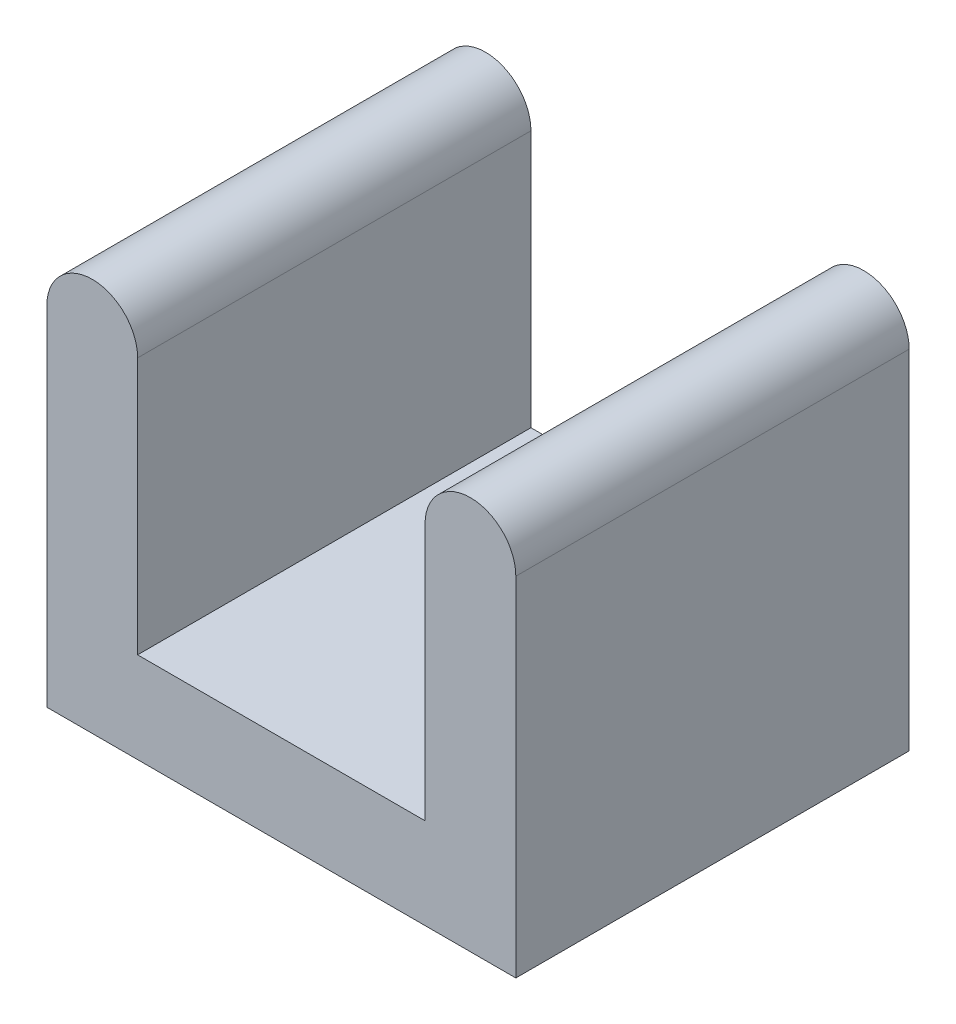
ISO-10303-21;
HEADER;
FILE_DESCRIPTION(('STEP AP214'),'2;1');
FILE_NAME('part.step','',(''),(''),'','','');
FILE_SCHEMA(('AUTOMOTIVE_DESIGN { 1 0 10303 214 1 1 1 1 }'));
ENDSEC;
DATA;
#1=APPLICATION_CONTEXT('core data for automotive mechanical design processes');
#2=APPLICATION_PROTOCOL_DEFINITION('international standard','automotive_design',2000,#1);
#3=PRODUCT_CONTEXT('',#1,'mechanical');
#4=PRODUCT('Part','Part','',(#3));
#5=PRODUCT_RELATED_PRODUCT_CATEGORY('part','',(#4));
#6=PRODUCT_DEFINITION_FORMATION('','',#4);
#7=PRODUCT_DEFINITION_CONTEXT('part definition',#1,'design');
#8=PRODUCT_DEFINITION('design','',#6,#7);
#9=PRODUCT_DEFINITION_SHAPE('','',#8);
#10=(LENGTH_UNIT() NAMED_UNIT(*) SI_UNIT(.MILLI.,.METRE.));
#11=(NAMED_UNIT(*) PLANE_ANGLE_UNIT() SI_UNIT($,.RADIAN.));
#12=(NAMED_UNIT(*) SI_UNIT($,.STERADIAN.) SOLID_ANGLE_UNIT());
#13=UNCERTAINTY_MEASURE_WITH_UNIT(LENGTH_MEASURE(1.E-05),#10,'distance_accuracy_value','');
#14=(GEOMETRIC_REPRESENTATION_CONTEXT(3) GLOBAL_UNCERTAINTY_ASSIGNED_CONTEXT((#13)) GLOBAL_UNIT_ASSIGNED_CONTEXT((#10,
#11,#12)) REPRESENTATION_CONTEXT('',''));
#15=CARTESIAN_POINT('',(0.,0.,0.));
#16=DIRECTION('',(0.,0.,1.));
#17=DIRECTION('',(1.,0.,0.));
#18=AXIS2_PLACEMENT_3D('',#15,#16,#17);
#19=CARTESIAN_POINT('',(-29.0441176470589,29.9264705882353,-1.));
#20=DIRECTION('',(0.,0.,1.));
#21=DIRECTION('',(1.,0.,0.));
#22=AXIS2_PLACEMENT_3D('',#19,#20,#21);
#23=CYLINDRICAL_SURFACE('',#22,3.);
#24=DIRECTION('',(0.,0.,1.));
#25=VECTOR('',#24,1.);
#26=CARTESIAN_POINT('',(-32.0441176470589,29.9264705882353,-1.));
#27=LINE('',#26,#25);
#28=CARTESIAN_POINT('',(-32.0441176470589,29.9264705882353,-1.));
#29=VERTEX_POINT('',#28);
#30=CARTESIAN_POINT('',(-32.0441176470589,29.9264705882353,25.));
#31=VERTEX_POINT('',#30);
#32=EDGE_CURVE('E52',#29,#31,#27,.T.);
#33=ORIENTED_EDGE('',*,*,#32,.T.);
#34=CARTESIAN_POINT('',(-29.0441176470589,29.9264705882353,25.));
#35=DIRECTION('',(0.,0.,-1.));
#36=DIRECTION('',(-1.,0.,0.));
#37=AXIS2_PLACEMENT_3D('',#34,#35,#36);
#38=CIRCLE('',#37,3.);
#39=CARTESIAN_POINT('',(-26.0441176470589,29.9264705882353,25.));
#40=VERTEX_POINT('',#39);
#41=EDGE_CURVE('E120',#31,#40,#38,.T.);
#42=ORIENTED_EDGE('',*,*,#41,.T.);
#43=DIRECTION('',(0.,0.,1.));
#44=VECTOR('',#43,1.);
#45=CARTESIAN_POINT('',(-26.0441176470589,29.9264705882353,-1.));
#46=LINE('',#45,#44);
#47=CARTESIAN_POINT('',(-26.0441176470589,29.9264705882353,-1.));
#48=VERTEX_POINT('',#47);
#49=EDGE_CURVE('E11',#48,#40,#46,.T.);
#50=ORIENTED_EDGE('',*,*,#49,.F.);
#51=CARTESIAN_POINT('',(-29.0441176470589,29.9264705882353,-1.));
#52=DIRECTION('',(0.,0.,-1.));
#53=DIRECTION('',(-1.,0.,0.));
#54=AXIS2_PLACEMENT_3D('',#51,#52,#53);
#55=CIRCLE('',#54,3.);
#56=EDGE_CURVE('E137',#29,#48,#55,.T.);
#57=ORIENTED_EDGE('',*,*,#56,.F.);
#58=EDGE_LOOP('',(#33,#42,#50,#57));
#59=FACE_BOUND('',#58,.T.);
#60=ADVANCED_FACE('F39',(#59),#23,.T.);
#61=CARTESIAN_POINT('',(-26.0441176470589,29.9264705882353,-1.));
#62=DIRECTION('',(-1.,0.,0.));
#63=DIRECTION('',(0.,0.,1.));
#64=AXIS2_PLACEMENT_3D('',#61,#62,#63);
#65=PLANE('',#64);
#66=ORIENTED_EDGE('',*,*,#49,.T.);
#67=DIRECTION('',(0.,-1.,0.));
#68=VECTOR('',#67,1.);
#69=CARTESIAN_POINT('',(-26.0441176470589,29.9264705882353,25.));
#70=LINE('',#69,#68);
#71=CARTESIAN_POINT('',(-26.0441176470589,12.9264705882353,25.));
#72=VERTEX_POINT('',#71);
#73=EDGE_CURVE('E110',#40,#72,#70,.T.);
#74=ORIENTED_EDGE('',*,*,#73,.T.);
#75=DIRECTION('',(0.,0.,1.));
#76=VECTOR('',#75,1.);
#77=CARTESIAN_POINT('',(-26.0441176470589,12.9264705882353,-1.));
#78=LINE('',#77,#76);
#79=CARTESIAN_POINT('',(-26.0441176470589,12.9264705882353,-1.));
#80=VERTEX_POINT('',#79);
#81=EDGE_CURVE('E46',#80,#72,#78,.T.);
#82=ORIENTED_EDGE('',*,*,#81,.F.);
#83=DIRECTION('',(0.,-1.,0.));
#84=VECTOR('',#83,1.);
#85=CARTESIAN_POINT('',(-26.0441176470589,29.9264705882353,-1.));
#86=LINE('',#85,#84);
#87=EDGE_CURVE('E108',#48,#80,#86,.T.);
#88=ORIENTED_EDGE('',*,*,#87,.F.);
#89=EDGE_LOOP('',(#66,#74,#82,#88));
#90=FACE_BOUND('',#89,.T.);
#91=ADVANCED_FACE('F102',(#90),#65,.F.);
#92=CARTESIAN_POINT('',(-26.0441176470589,12.9264705882353,-1.));
#93=DIRECTION('',(0.,-1.,0.));
#94=DIRECTION('',(0.,0.,-1.));
#95=AXIS2_PLACEMENT_3D('',#92,#93,#94);
#96=PLANE('',#95);
#97=ORIENTED_EDGE('',*,*,#81,.T.);
#98=DIRECTION('',(1.,0.,0.));
#99=VECTOR('',#98,1.);
#100=CARTESIAN_POINT('',(-26.0441176470589,12.9264705882353,25.));
#101=LINE('',#100,#99);
#102=CARTESIAN_POINT('',(-7.04411764705888,12.9264705882353,25.));
#103=VERTEX_POINT('',#102);
#104=EDGE_CURVE('E119',#72,#103,#101,.T.);
#105=ORIENTED_EDGE('',*,*,#104,.T.);
#106=DIRECTION('',(0.,0.,1.));
#107=VECTOR('',#106,1.);
#108=CARTESIAN_POINT('',(-7.04411764705888,12.9264705882353,-1.));
#109=LINE('',#108,#107);
#110=CARTESIAN_POINT('',(-7.04411764705888,12.9264705882353,-1.));
#111=VERTEX_POINT('',#110);
#112=EDGE_CURVE('E165',#111,#103,#109,.T.);
#113=ORIENTED_EDGE('',*,*,#112,.F.);
#114=DIRECTION('',(1.,0.,0.));
#115=VECTOR('',#114,1.);
#116=CARTESIAN_POINT('',(-26.0441176470589,12.9264705882353,-1.));
#117=LINE('',#116,#115);
#118=EDGE_CURVE('E145',#80,#111,#117,.T.);
#119=ORIENTED_EDGE('',*,*,#118,.F.);
#120=EDGE_LOOP('',(#97,#105,#113,#119));
#121=FACE_BOUND('',#120,.T.);
#122=ADVANCED_FACE('F170',(#121),#96,.F.);
#123=CARTESIAN_POINT('',(-7.04411764705888,12.9264705882353,-1.));
#124=DIRECTION('',(1.,0.,0.));
#125=DIRECTION('',(0.,0.,-1.));
#126=AXIS2_PLACEMENT_3D('',#123,#124,#125);
#127=PLANE('',#126);
#128=ORIENTED_EDGE('',*,*,#112,.T.);
#129=DIRECTION('',(0.,1.,0.));
#130=VECTOR('',#129,1.);
#131=CARTESIAN_POINT('',(-7.04411764705888,12.9264705882353,25.));
#132=LINE('',#131,#130);
#133=CARTESIAN_POINT('',(-7.04411764705888,29.9264705882353,25.));
#134=VERTEX_POINT('',#133);
#135=EDGE_CURVE('E123',#103,#134,#132,.T.);
#136=ORIENTED_EDGE('',*,*,#135,.T.);
#137=DIRECTION('',(0.,0.,1.));
#138=VECTOR('',#137,1.);
#139=CARTESIAN_POINT('',(-7.04411764705888,29.9264705882353,-1.));
#140=LINE('',#139,#138);
#141=CARTESIAN_POINT('',(-7.04411764705888,29.9264705882353,-1.));
#142=VERTEX_POINT('',#141);
#143=EDGE_CURVE('E162',#142,#134,#140,.T.);
#144=ORIENTED_EDGE('',*,*,#143,.F.);
#145=DIRECTION('',(0.,1.,0.));
#146=VECTOR('',#145,1.);
#147=CARTESIAN_POINT('',(-7.04411764705888,12.9264705882353,-1.));
#148=LINE('',#147,#146);
#149=EDGE_CURVE('E144',#111,#142,#148,.T.);
#150=ORIENTED_EDGE('',*,*,#149,.F.);
#151=EDGE_LOOP('',(#128,#136,#144,#150));
#152=FACE_BOUND('',#151,.T.);
#153=ADVANCED_FACE('F184',(#152),#127,.F.);
#154=CARTESIAN_POINT('',(-4.04411764705888,29.9264705882353,-1.));
#155=DIRECTION('',(0.,0.,1.));
#156=DIRECTION('',(1.,0.,0.));
#157=AXIS2_PLACEMENT_3D('',#154,#155,#156);
#158=CYLINDRICAL_SURFACE('',#157,3.);
#159=ORIENTED_EDGE('',*,*,#143,.T.);
#160=CARTESIAN_POINT('',(-4.04411764705888,29.9264705882353,25.));
#161=DIRECTION('',(0.,0.,1.));
#162=DIRECTION('',(1.,0.,0.));
#163=AXIS2_PLACEMENT_3D('',#160,#161,#162);
#164=CIRCLE('',#163,3.);
#165=CARTESIAN_POINT('',(-1.04411764705888,29.9264705882353,25.));
#166=VERTEX_POINT('',#165);
#167=EDGE_CURVE('E129',#166,#134,#164,.T.);
#168=ORIENTED_EDGE('',*,*,#167,.F.);
#169=DIRECTION('',(0.,0.,1.));
#170=VECTOR('',#169,1.);
#171=CARTESIAN_POINT('',(-1.04411764705888,29.9264705882353,-1.));
#172=LINE('',#171,#170);
#173=CARTESIAN_POINT('',(-1.04411764705888,29.9264705882353,-1.));
#174=VERTEX_POINT('',#173);
#175=EDGE_CURVE('E159',#174,#166,#172,.T.);
#176=ORIENTED_EDGE('',*,*,#175,.F.);
#177=CARTESIAN_POINT('',(-4.04411764705888,29.9264705882353,-1.));
#178=DIRECTION('',(0.,0.,1.));
#179=DIRECTION('',(1.,0.,0.));
#180=AXIS2_PLACEMENT_3D('',#177,#178,#179);
#181=CIRCLE('',#180,3.);
#182=EDGE_CURVE('E147',#174,#142,#181,.T.);
#183=ORIENTED_EDGE('',*,*,#182,.T.);
#184=EDGE_LOOP('',(#159,#168,#176,#183));
#185=FACE_BOUND('',#184,.T.);
#186=ADVANCED_FACE('F185',(#185),#158,.T.);
#187=CARTESIAN_POINT('',(-1.04411764705888,6.92647058823531,-1.));
#188=DIRECTION('',(1.,0.,0.));
#189=DIRECTION('',(0.,0.,-1.));
#190=AXIS2_PLACEMENT_3D('',#187,#188,#189);
#191=PLANE('',#190);
#192=ORIENTED_EDGE('',*,*,#175,.T.);
#193=DIRECTION('',(0.,1.,0.));
#194=VECTOR('',#193,1.);
#195=CARTESIAN_POINT('',(-1.04411764705888,6.92647058823531,25.));
#196=LINE('',#195,#194);
#197=CARTESIAN_POINT('',(-1.04411764705888,6.92647058823531,25.));
#198=VERTEX_POINT('',#197);
#199=EDGE_CURVE('E132',#198,#166,#196,.T.);
#200=ORIENTED_EDGE('',*,*,#199,.F.);
#201=DIRECTION('',(0.,0.,1.));
#202=VECTOR('',#201,1.);
#203=CARTESIAN_POINT('',(-1.04411764705888,6.92647058823531,-1.));
#204=LINE('',#203,#202);
#205=CARTESIAN_POINT('',(-1.04411764705888,6.92647058823531,-1.));
#206=VERTEX_POINT('',#205);
#207=EDGE_CURVE('E156',#206,#198,#204,.T.);
#208=ORIENTED_EDGE('',*,*,#207,.F.);
#209=DIRECTION('',(0.,1.,0.));
#210=VECTOR('',#209,1.);
#211=CARTESIAN_POINT('',(-1.04411764705888,6.92647058823531,-1.));
#212=LINE('',#211,#210);
#213=EDGE_CURVE('E146',#206,#174,#212,.T.);
#214=ORIENTED_EDGE('',*,*,#213,.T.);
#215=EDGE_LOOP('',(#192,#200,#208,#214));
#216=FACE_BOUND('',#215,.T.);
#217=ADVANCED_FACE('F179',(#216),#191,.T.);
#218=CARTESIAN_POINT('',(-32.0441176470589,6.92647058823531,-1.));
#219=DIRECTION('',(0.,-1.,0.));
#220=DIRECTION('',(0.,0.,-1.));
#221=AXIS2_PLACEMENT_3D('',#218,#219,#220);
#222=PLANE('',#221);
#223=ORIENTED_EDGE('',*,*,#207,.T.);
#224=DIRECTION('',(1.,0.,0.));
#225=VECTOR('',#224,1.);
#226=CARTESIAN_POINT('',(-32.0441176470589,6.92647058823531,25.));
#227=LINE('',#226,#225);
#228=CARTESIAN_POINT('',(-32.0441176470589,6.92647058823531,25.));
#229=VERTEX_POINT('',#228);
#230=EDGE_CURVE('E131',#229,#198,#227,.T.);
#231=ORIENTED_EDGE('',*,*,#230,.F.);
#232=DIRECTION('',(0.,0.,1.));
#233=VECTOR('',#232,1.);
#234=CARTESIAN_POINT('',(-32.0441176470589,6.92647058823531,-1.));
#235=LINE('',#234,#233);
#236=CARTESIAN_POINT('',(-32.0441176470589,6.92647058823531,-1.));
#237=VERTEX_POINT('',#236);
#238=EDGE_CURVE('E62',#237,#229,#235,.T.);
#239=ORIENTED_EDGE('',*,*,#238,.F.);
#240=DIRECTION('',(1.,0.,0.));
#241=VECTOR('',#240,1.);
#242=CARTESIAN_POINT('',(-32.0441176470589,6.92647058823531,-1.));
#243=LINE('',#242,#241);
#244=EDGE_CURVE('E154',#237,#206,#243,.T.);
#245=ORIENTED_EDGE('',*,*,#244,.T.);
#246=EDGE_LOOP('',(#223,#231,#239,#245));
#247=FACE_BOUND('',#246,.T.);
#248=ADVANCED_FACE('F178',(#247),#222,.T.);
#249=CARTESIAN_POINT('',(-32.0441176470589,29.9264705882353,-1.));
#250=DIRECTION('',(-1.,0.,0.));
#251=DIRECTION('',(0.,0.,1.));
#252=AXIS2_PLACEMENT_3D('',#249,#250,#251);
#253=PLANE('',#252);
#254=ORIENTED_EDGE('',*,*,#238,.T.);
#255=DIRECTION('',(0.,-1.,0.));
#256=VECTOR('',#255,1.);
#257=CARTESIAN_POINT('',(-32.0441176470589,29.9264705882353,25.));
#258=LINE('',#257,#256);
#259=EDGE_CURVE('E140',#31,#229,#258,.T.);
#260=ORIENTED_EDGE('',*,*,#259,.F.);
#261=ORIENTED_EDGE('',*,*,#32,.F.);
#262=DIRECTION('',(0.,-1.,0.));
#263=VECTOR('',#262,1.);
#264=CARTESIAN_POINT('',(-32.0441176470589,29.9264705882353,-1.));
#265=LINE('',#264,#263);
#266=EDGE_CURVE('E151',#29,#237,#265,.T.);
#267=ORIENTED_EDGE('',*,*,#266,.T.);
#268=EDGE_LOOP('',(#254,#260,#261,#267));
#269=FACE_BOUND('',#268,.T.);
#270=ADVANCED_FACE('F176',(#269),#253,.T.);
#271=CARTESIAN_POINT('',(-29.0441176470589,29.9264705882353,-1.));
#272=DIRECTION('',(0.,0.,-1.));
#273=DIRECTION('',(-1.,0.,0.));
#274=AXIS2_PLACEMENT_3D('',#271,#272,#273);
#275=PLANE('',#274);
#276=ORIENTED_EDGE('',*,*,#56,.T.);
#277=ORIENTED_EDGE('',*,*,#87,.T.);
#278=ORIENTED_EDGE('',*,*,#118,.T.);
#279=ORIENTED_EDGE('',*,*,#149,.T.);
#280=ORIENTED_EDGE('',*,*,#182,.F.);
#281=ORIENTED_EDGE('',*,*,#213,.F.);
#282=ORIENTED_EDGE('',*,*,#244,.F.);
#283=ORIENTED_EDGE('',*,*,#266,.F.);
#284=EDGE_LOOP('',(#276,#277,#278,#279,#280,#281,#282,#283));
#285=FACE_BOUND('',#284,.T.);
#286=ADVANCED_FACE('F171',(#285),#275,.T.);
#287=CARTESIAN_POINT('',(-29.0441176470589,29.9264705882353,25.));
#288=DIRECTION('',(0.,0.,-1.));
#289=DIRECTION('',(-1.,0.,0.));
#290=AXIS2_PLACEMENT_3D('',#287,#288,#289);
#291=PLANE('',#290);
#292=ORIENTED_EDGE('',*,*,#41,.F.);
#293=ORIENTED_EDGE('',*,*,#259,.T.);
#294=ORIENTED_EDGE('',*,*,#230,.T.);
#295=ORIENTED_EDGE('',*,*,#199,.T.);
#296=ORIENTED_EDGE('',*,*,#167,.T.);
#297=ORIENTED_EDGE('',*,*,#135,.F.);
#298=ORIENTED_EDGE('',*,*,#104,.F.);
#299=ORIENTED_EDGE('',*,*,#73,.F.);
#300=EDGE_LOOP('',(#292,#293,#294,#295,#296,#297,#298,#299));
#301=FACE_BOUND('',#300,.T.);
#302=ADVANCED_FACE('F114',(#301),#291,.F.);
#303=CLOSED_SHELL('',(#60,#91,#122,#153,#186,#217,#248,#270,#286,#302));
#304=MANIFOLD_SOLID_BREP('B2',#303);
#305=ADVANCED_BREP_SHAPE_REPRESENTATION('',(#18,#304),#14);
#306=SHAPE_DEFINITION_REPRESENTATION(#9,#305);
ENDSEC;
END-ISO-10303-21;
